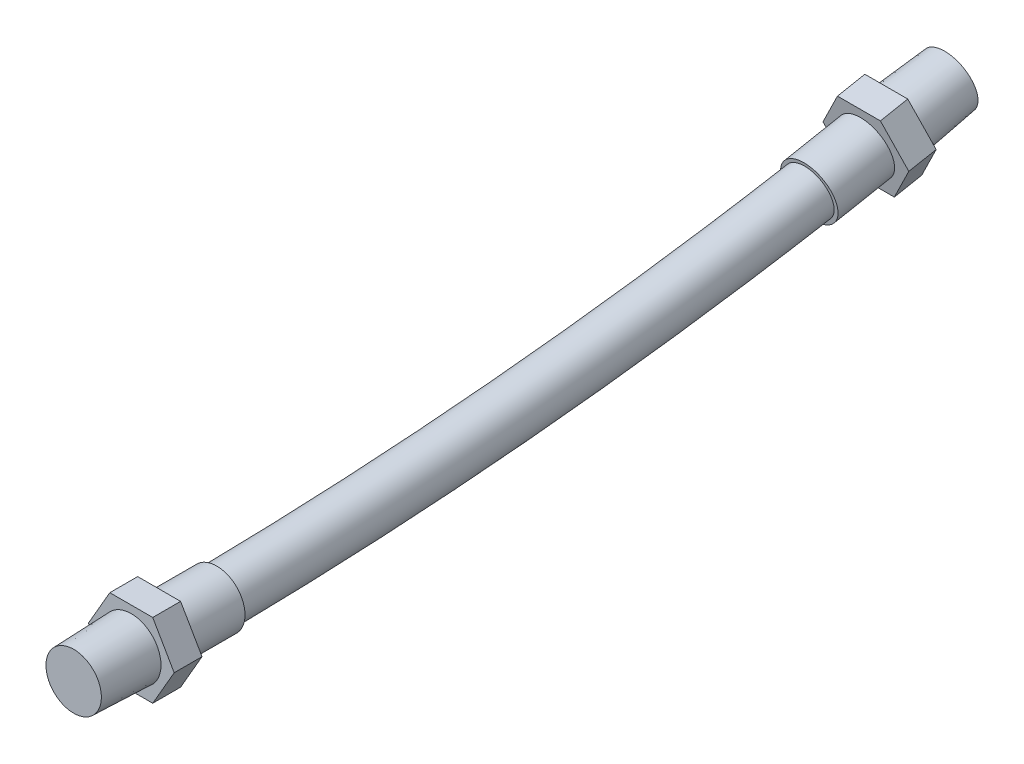
ISO-10303-21;
HEADER;
FILE_DESCRIPTION(('STEP AP214'),'2;1');
FILE_NAME('part.step','',(''),(''),'','','');
FILE_SCHEMA(('AUTOMOTIVE_DESIGN { 1 0 10303 214 1 1 1 1 }'));
ENDSEC;
DATA;
#1=APPLICATION_CONTEXT('core data for automotive mechanical design processes');
#2=APPLICATION_PROTOCOL_DEFINITION('international standard','automotive_design',2000,#1);
#3=PRODUCT_CONTEXT('',#1,'mechanical');
#4=PRODUCT('Part','Part','',(#3));
#5=PRODUCT_RELATED_PRODUCT_CATEGORY('part','',(#4));
#6=PRODUCT_DEFINITION_FORMATION('','',#4);
#7=PRODUCT_DEFINITION_CONTEXT('part definition',#1,'design');
#8=PRODUCT_DEFINITION('design','',#6,#7);
#9=PRODUCT_DEFINITION_SHAPE('','',#8);
#10=(LENGTH_UNIT() NAMED_UNIT(*) SI_UNIT(.MILLI.,.METRE.));
#11=(NAMED_UNIT(*) PLANE_ANGLE_UNIT() SI_UNIT($,.RADIAN.));
#12=(NAMED_UNIT(*) SI_UNIT($,.STERADIAN.) SOLID_ANGLE_UNIT());
#13=UNCERTAINTY_MEASURE_WITH_UNIT(LENGTH_MEASURE(1.E-05),#10,'distance_accuracy_value','');
#14=(GEOMETRIC_REPRESENTATION_CONTEXT(3) GLOBAL_UNCERTAINTY_ASSIGNED_CONTEXT((#13)) GLOBAL_UNIT_ASSIGNED_CONTEXT((#10,
#11,#12)) REPRESENTATION_CONTEXT('',''));
#15=CARTESIAN_POINT('',(0.,0.,0.));
#16=DIRECTION('',(0.,0.,1.));
#17=DIRECTION('',(1.,0.,0.));
#18=AXIS2_PLACEMENT_3D('',#15,#16,#17);
#19=CARTESIAN_POINT('',(3.66617420935412,-6.35,4.7625));
#20=DIRECTION('',(-0.866025403784439,0.499999999999999,0.));
#21=DIRECTION('',(-0.5,-0.866025403784439,0.));
#22=AXIS2_PLACEMENT_3D('',#19,#20,#21);
#23=PLANE('',#22);
#24=DIRECTION('',(0.5,0.866025403784439,0.));
#25=VECTOR('',#24,1.);
#26=CARTESIAN_POINT('',(3.66617420935412,-6.35,0.));
#27=LINE('',#26,#25);
#28=CARTESIAN_POINT('',(3.66617420935412,-6.35,0.));
#29=VERTEX_POINT('',#28);
#30=CARTESIAN_POINT('',(7.33234841870825,0.,0.));
#31=VERTEX_POINT('',#30);
#32=EDGE_CURVE('E129',#29,#31,#27,.T.);
#33=ORIENTED_EDGE('',*,*,#32,.T.);
#34=DIRECTION('',(0.,0.,-1.));
#35=VECTOR('',#34,1.);
#36=CARTESIAN_POINT('',(7.33234841870825,0.,4.7625));
#37=LINE('',#36,#35);
#38=CARTESIAN_POINT('',(7.33234841870825,0.,4.7625));
#39=VERTEX_POINT('',#38);
#40=EDGE_CURVE('E147',#39,#31,#37,.T.);
#41=ORIENTED_EDGE('',*,*,#40,.F.);
#42=DIRECTION('',(0.5,0.866025403784439,0.));
#43=VECTOR('',#42,1.);
#44=CARTESIAN_POINT('',(3.66617420935412,-6.35,4.7625));
#45=LINE('',#44,#43);
#46=CARTESIAN_POINT('',(3.66617420935412,-6.35,4.7625));
#47=VERTEX_POINT('',#46);
#48=EDGE_CURVE('E140',#47,#39,#45,.T.);
#49=ORIENTED_EDGE('',*,*,#48,.F.);
#50=DIRECTION('',(0.,0.,-1.));
#51=VECTOR('',#50,1.);
#52=CARTESIAN_POINT('',(3.66617420935412,-6.35,4.7625));
#53=LINE('',#52,#51);
#54=EDGE_CURVE('E125',#47,#29,#53,.T.);
#55=ORIENTED_EDGE('',*,*,#54,.T.);
#56=EDGE_LOOP('',(#33,#41,#49,#55));
#57=FACE_BOUND('',#56,.T.);
#58=ADVANCED_FACE('F32',(#57),#23,.F.);
#59=CARTESIAN_POINT('',(7.33234841870825,0.,4.7625));
#60=DIRECTION('',(-0.866025403784439,-0.5,0.));
#61=DIRECTION('',(0.5,-0.866025403784439,0.));
#62=AXIS2_PLACEMENT_3D('',#59,#60,#61);
#63=PLANE('',#62);
#64=DIRECTION('',(-0.5,0.866025403784439,0.));
#65=VECTOR('',#64,1.);
#66=CARTESIAN_POINT('',(7.33234841870825,0.,0.));
#67=LINE('',#66,#65);
#68=CARTESIAN_POINT('',(3.66617420935412,6.35000000000001,0.));
#69=VERTEX_POINT('',#68);
#70=EDGE_CURVE('E132',#31,#69,#67,.T.);
#71=ORIENTED_EDGE('',*,*,#70,.T.);
#72=DIRECTION('',(0.,0.,-1.));
#73=VECTOR('',#72,1.);
#74=CARTESIAN_POINT('',(3.66617420935412,6.35000000000001,4.7625));
#75=LINE('',#74,#73);
#76=CARTESIAN_POINT('',(3.66617420935412,6.35000000000001,4.7625));
#77=VERTEX_POINT('',#76);
#78=EDGE_CURVE('E144',#77,#69,#75,.T.);
#79=ORIENTED_EDGE('',*,*,#78,.F.);
#80=DIRECTION('',(-0.5,0.866025403784439,0.));
#81=VECTOR('',#80,1.);
#82=CARTESIAN_POINT('',(7.33234841870825,0.,4.7625));
#83=LINE('',#82,#81);
#84=EDGE_CURVE('E95',#39,#77,#83,.T.);
#85=ORIENTED_EDGE('',*,*,#84,.F.);
#86=ORIENTED_EDGE('',*,*,#40,.T.);
#87=EDGE_LOOP('',(#71,#79,#85,#86));
#88=FACE_BOUND('',#87,.T.);
#89=ADVANCED_FACE('F192',(#88),#63,.F.);
#90=CARTESIAN_POINT('',(3.66617420935412,6.35000000000001,4.7625));
#91=DIRECTION('',(0.,-1.,0.));
#92=DIRECTION('',(0.,0.,-1.));
#93=AXIS2_PLACEMENT_3D('',#90,#91,#92);
#94=PLANE('',#93);
#95=DIRECTION('',(-1.,0.,0.));
#96=VECTOR('',#95,1.);
#97=CARTESIAN_POINT('',(3.66617420935412,6.35000000000001,0.));
#98=LINE('',#97,#96);
#99=CARTESIAN_POINT('',(-3.66617420935413,6.35000000000001,0.));
#100=VERTEX_POINT('',#99);
#101=EDGE_CURVE('E135',#69,#100,#98,.T.);
#102=ORIENTED_EDGE('',*,*,#101,.T.);
#103=DIRECTION('',(0.,0.,-1.));
#104=VECTOR('',#103,1.);
#105=CARTESIAN_POINT('',(-3.66617420935413,6.35000000000001,4.7625));
#106=LINE('',#105,#104);
#107=CARTESIAN_POINT('',(-3.66617420935413,6.35000000000001,4.7625));
#108=VERTEX_POINT('',#107);
#109=EDGE_CURVE('E120',#108,#100,#106,.T.);
#110=ORIENTED_EDGE('',*,*,#109,.F.);
#111=DIRECTION('',(-1.,0.,0.));
#112=VECTOR('',#111,1.);
#113=CARTESIAN_POINT('',(3.66617420935412,6.35000000000001,4.7625));
#114=LINE('',#113,#112);
#115=EDGE_CURVE('E111',#77,#108,#114,.T.);
#116=ORIENTED_EDGE('',*,*,#115,.F.);
#117=ORIENTED_EDGE('',*,*,#78,.T.);
#118=EDGE_LOOP('',(#102,#110,#116,#117));
#119=FACE_BOUND('',#118,.T.);
#120=ADVANCED_FACE('F189',(#119),#94,.F.);
#121=CARTESIAN_POINT('',(-3.66617420935413,6.35000000000001,4.7625));
#122=DIRECTION('',(0.866025403784439,-0.5,0.));
#123=DIRECTION('',(0.5,0.866025403784439,0.));
#124=AXIS2_PLACEMENT_3D('',#121,#122,#123);
#125=PLANE('',#124);
#126=DIRECTION('',(-0.5,-0.866025403784439,0.));
#127=VECTOR('',#126,1.);
#128=CARTESIAN_POINT('',(-3.66617420935413,6.35000000000001,0.));
#129=LINE('',#128,#127);
#130=CARTESIAN_POINT('',(-7.33234841870825,0.,0.));
#131=VERTEX_POINT('',#130);
#132=EDGE_CURVE('E119',#100,#131,#129,.T.);
#133=ORIENTED_EDGE('',*,*,#132,.T.);
#134=DIRECTION('',(0.,0.,-1.));
#135=VECTOR('',#134,1.);
#136=CARTESIAN_POINT('',(-7.33234841870825,0.,4.7625));
#137=LINE('',#136,#135);
#138=CARTESIAN_POINT('',(-7.33234841870825,0.,4.7625));
#139=VERTEX_POINT('',#138);
#140=EDGE_CURVE('E116',#139,#131,#137,.T.);
#141=ORIENTED_EDGE('',*,*,#140,.F.);
#142=DIRECTION('',(-0.5,-0.866025403784439,0.));
#143=VECTOR('',#142,1.);
#144=CARTESIAN_POINT('',(-3.66617420935413,6.35000000000001,4.7625));
#145=LINE('',#144,#143);
#146=EDGE_CURVE('E105',#108,#139,#145,.T.);
#147=ORIENTED_EDGE('',*,*,#146,.F.);
#148=ORIENTED_EDGE('',*,*,#109,.T.);
#149=EDGE_LOOP('',(#133,#141,#147,#148));
#150=FACE_BOUND('',#149,.T.);
#151=ADVANCED_FACE('F117',(#150),#125,.F.);
#152=CARTESIAN_POINT('',(-7.33234841870825,0.,4.7625));
#153=DIRECTION('',(0.866025403784439,0.5,0.));
#154=DIRECTION('',(-0.5,0.866025403784439,0.));
#155=AXIS2_PLACEMENT_3D('',#152,#153,#154);
#156=PLANE('',#155);
#157=DIRECTION('',(0.5,-0.866025403784439,0.));
#158=VECTOR('',#157,1.);
#159=CARTESIAN_POINT('',(-7.33234841870825,0.,0.));
#160=LINE('',#159,#158);
#161=CARTESIAN_POINT('',(-3.66617420935413,-6.35,0.));
#162=VERTEX_POINT('',#161);
#163=EDGE_CURVE('E80',#131,#162,#160,.T.);
#164=ORIENTED_EDGE('',*,*,#163,.T.);
#165=DIRECTION('',(0.,0.,-1.));
#166=VECTOR('',#165,1.);
#167=CARTESIAN_POINT('',(-3.66617420935413,-6.35,4.7625));
#168=LINE('',#167,#166);
#169=CARTESIAN_POINT('',(-3.66617420935413,-6.35,4.7625));
#170=VERTEX_POINT('',#169);
#171=EDGE_CURVE('E121',#170,#162,#168,.T.);
#172=ORIENTED_EDGE('',*,*,#171,.F.);
#173=DIRECTION('',(0.5,-0.866025403784439,0.));
#174=VECTOR('',#173,1.);
#175=CARTESIAN_POINT('',(-7.33234841870825,0.,4.7625));
#176=LINE('',#175,#174);
#177=EDGE_CURVE('E109',#139,#170,#176,.T.);
#178=ORIENTED_EDGE('',*,*,#177,.F.);
#179=ORIENTED_EDGE('',*,*,#140,.T.);
#180=EDGE_LOOP('',(#164,#172,#178,#179));
#181=FACE_BOUND('',#180,.T.);
#182=ADVANCED_FACE('F123',(#181),#156,.F.);
#183=CARTESIAN_POINT('',(-3.66617420935413,-6.35,4.7625));
#184=DIRECTION('',(0.,1.,0.));
#185=DIRECTION('',(-1.,0.,0.));
#186=AXIS2_PLACEMENT_3D('',#183,#184,#185);
#187=PLANE('',#186);
#188=DIRECTION('',(1.,0.,0.));
#189=VECTOR('',#188,1.);
#190=CARTESIAN_POINT('',(-3.66617420935413,-6.35,0.));
#191=LINE('',#190,#189);
#192=EDGE_CURVE('E86',#162,#29,#191,.T.);
#193=ORIENTED_EDGE('',*,*,#192,.T.);
#194=ORIENTED_EDGE('',*,*,#54,.F.);
#195=DIRECTION('',(1.,0.,0.));
#196=VECTOR('',#195,1.);
#197=CARTESIAN_POINT('',(-3.66617420935413,-6.35,4.7625));
#198=LINE('',#197,#196);
#199=EDGE_CURVE('E56',#170,#47,#198,.T.);
#200=ORIENTED_EDGE('',*,*,#199,.F.);
#201=ORIENTED_EDGE('',*,*,#171,.T.);
#202=EDGE_LOOP('',(#193,#194,#200,#201));
#203=FACE_BOUND('',#202,.T.);
#204=ADVANCED_FACE('F178',(#203),#187,.F.);
#205=CARTESIAN_POINT('',(0.,0.,4.7625));
#206=DIRECTION('',(0.,0.,1.));
#207=DIRECTION('',(1.,0.,0.));
#208=AXIS2_PLACEMENT_3D('',#205,#206,#207);
#209=PLANE('',#208);
#210=CARTESIAN_POINT('',(0.,0.,4.7625));
#211=DIRECTION('',(0.,0.,1.));
#212=DIRECTION('',(1.,0.,0.));
#213=AXIS2_PLACEMENT_3D('',#210,#211,#212);
#214=CIRCLE('',#213,5.08);
#215=CARTESIAN_POINT('',(5.08,0.,4.7625));
#216=VERTEX_POINT('',#215);
#217=EDGE_CURVE('E47',#216,#216,#214,.T.);
#218=ORIENTED_EDGE('',*,*,#217,.F.);
#219=EDGE_LOOP('',(#218));
#220=FACE_BOUND('',#219,.T.);
#221=ORIENTED_EDGE('',*,*,#48,.T.);
#222=ORIENTED_EDGE('',*,*,#84,.T.);
#223=ORIENTED_EDGE('',*,*,#115,.T.);
#224=ORIENTED_EDGE('',*,*,#146,.T.);
#225=ORIENTED_EDGE('',*,*,#177,.T.);
#226=ORIENTED_EDGE('',*,*,#199,.T.);
#227=EDGE_LOOP('',(#221,#222,#223,#224,#225,#226));
#228=FACE_BOUND('',#227,.T.);
#229=ADVANCED_FACE('F107',(#220,#228),#209,.T.);
#230=CARTESIAN_POINT('',(0.,0.,0.));
#231=DIRECTION('',(0.,0.,1.));
#232=DIRECTION('',(1.,0.,0.));
#233=AXIS2_PLACEMENT_3D('',#230,#231,#232);
#234=PLANE('',#233);
#235=CARTESIAN_POINT('',(0.,0.,0.));
#236=DIRECTION('',(0.,0.,1.));
#237=DIRECTION('',(1.,0.,0.));
#238=AXIS2_PLACEMENT_3D('',#235,#236,#237);
#239=CIRCLE('',#238,4.826);
#240=CARTESIAN_POINT('',(4.826,0.,0.));
#241=VERTEX_POINT('',#240);
#242=EDGE_CURVE('E11',#241,#241,#239,.F.);
#243=ORIENTED_EDGE('',*,*,#242,.F.);
#244=EDGE_LOOP('',(#243));
#245=FACE_BOUND('',#244,.T.);
#246=ORIENTED_EDGE('',*,*,#32,.F.);
#247=ORIENTED_EDGE('',*,*,#192,.F.);
#248=ORIENTED_EDGE('',*,*,#163,.F.);
#249=ORIENTED_EDGE('',*,*,#132,.F.);
#250=ORIENTED_EDGE('',*,*,#101,.F.);
#251=ORIENTED_EDGE('',*,*,#70,.F.);
#252=EDGE_LOOP('',(#246,#247,#248,#249,#250,#251));
#253=FACE_BOUND('',#252,.T.);
#254=ADVANCED_FACE('F174',(#245,#253),#234,.F.);
#255=CARTESIAN_POINT('',(0.,0.,4.7625));
#256=DIRECTION('',(0.,0.,-1.));
#257=DIRECTION('',(1.,0.,0.));
#258=AXIS2_PLACEMENT_3D('',#255,#256,#257);
#259=CONICAL_SURFACE('',#258,5.08,0.0349065850398866);
#260=CARTESIAN_POINT('',(0.,0.,14.605));
#261=DIRECTION('',(0.,0.,1.));
#262=DIRECTION('',(1.,0.,0.));
#263=AXIS2_PLACEMENT_3D('',#260,#261,#262);
#264=CIRCLE('',#263,4.73629232627747);
#265=CARTESIAN_POINT('',(4.73629232627747,0.,14.605));
#266=VERTEX_POINT('',#265);
#267=EDGE_CURVE('E133',#266,#266,#264,.T.);
#268=ORIENTED_EDGE('',*,*,#267,.F.);
#269=EDGE_LOOP('',(#268));
#270=FACE_BOUND('',#269,.T.);
#271=ORIENTED_EDGE('',*,*,#217,.T.);
#272=EDGE_LOOP('',(#271));
#273=FACE_BOUND('',#272,.T.);
#274=ADVANCED_FACE('F170',(#270,#273),#259,.T.);
#275=CARTESIAN_POINT('',(0.,0.,14.605));
#276=DIRECTION('',(0.,0.,1.));
#277=DIRECTION('',(1.,0.,0.));
#278=AXIS2_PLACEMENT_3D('',#275,#276,#277);
#279=PLANE('',#278);
#280=ORIENTED_EDGE('',*,*,#267,.T.);
#281=EDGE_LOOP('',(#280));
#282=FACE_BOUND('',#281,.T.);
#283=ADVANCED_FACE('F161',(#282),#279,.T.);
#284=CARTESIAN_POINT('',(0.,0.,-9.8425));
#285=DIRECTION('',(0.,0.,-1.));
#286=DIRECTION('',(-1.,0.,0.));
#287=AXIS2_PLACEMENT_3D('',#284,#285,#286);
#288=PLANE('',#287);
#289=CARTESIAN_POINT('',(0.,0.,-9.8425));
#290=DIRECTION('',(0.,0.,-1.));
#291=DIRECTION('',(-1.,0.,0.));
#292=AXIS2_PLACEMENT_3D('',#289,#290,#291);
#293=CIRCLE('',#292,4.826);
#294=CARTESIAN_POINT('',(-4.826,0.,-9.8425));
#295=VERTEX_POINT('',#294);
#296=EDGE_CURVE('E154',#295,#295,#293,.T.);
#297=ORIENTED_EDGE('',*,*,#296,.T.);
#298=EDGE_LOOP('',(#297));
#299=FACE_BOUND('',#298,.T.);
#300=CARTESIAN_POINT('',(-2.96557878047052,-2.8864777574931,-9.8425));
#301=CARTESIAN_POINT('',(-3.1319274965473,-2.71985959375388,-9.8425));
#302=CARTESIAN_POINT('',(-3.28432553139563,-2.53907065060835,-9.8425));
#303=CARTESIAN_POINT('',(-3.55672795271336,-2.15431894818747,-9.8425));
#304=CARTESIAN_POINT('',(-3.67669305796996,-1.95032850921932,-9.8425));
#305=CARTESIAN_POINT('',(-3.88061945775281,-1.52517954267242,-9.8425));
#306=CARTESIAN_POINT('',(-3.96459806072511,-1.30402932902719,-9.8425));
#307=CARTESIAN_POINT('',(-4.09421268723008,-0.850829894358464,-9.8425));
#308=CARTESIAN_POINT('',(-4.13985823553484,-0.618783395919967,-9.8425));
#309=CARTESIAN_POINT('',(-4.19155845363318,-0.150279834976739,-9.8425));
#310=CARTESIAN_POINT('',(-4.19760641415862,0.0861779681568454,-9.8425));
#311=CARTESIAN_POINT('',(-4.16991979168381,0.556762035416266,-9.8425));
#312=CARTESIAN_POINT('',(-4.13618363437283,0.790888206906599,-9.8425));
#313=CARTESIAN_POINT('',(-4.02988311628325,1.25015613494171,-9.8425));
#314=CARTESIAN_POINT('',(-3.95731835576464,1.47529779896545,-9.8425));
#315=CARTESIAN_POINT('',(-3.77541914290732,1.91020169681065,-9.8425));
#316=CARTESIAN_POINT('',(-3.6660847697806,2.11996396376244,-9.8425));
#317=CARTESIAN_POINT('',(-3.4137543615793,2.51814448032545,-9.8425));
#318=CARTESIAN_POINT('',(-3.27075982527992,2.70656367971941,-9.8425));
#319=CARTESIAN_POINT('',(-2.95516475902218,3.05671758037109,-9.8425));
#320=CARTESIAN_POINT('',(-2.78256429733572,3.21845234316201,-9.8425));
#321=CARTESIAN_POINT('',(-2.41267538154885,3.51062880417156,-9.8425));
#322=CARTESIAN_POINT('',(-2.21538943885816,3.64107368177519,-9.8425));
#323=CARTESIAN_POINT('',(-1.80171574723512,3.86698624188334,-9.8425));
#324=CARTESIAN_POINT('',(-1.58532799032638,3.96245390978225,-9.8425));
#325=CARTESIAN_POINT('',(-1.1396197884299,4.11569078915616,-9.8425));
#326=CARTESIAN_POINT('',(-0.910300809927761,4.17346426609658,-9.8425));
#327=CARTESIAN_POINT('',(-0.445218229528382,4.24968864447811,-9.8425));
#328=CARTESIAN_POINT('',(-0.20945463342387,4.26813958126302,-9.8425));
#329=CARTESIAN_POINT('',(0.261806188605222,4.26519485343562,-9.8425));
#330=CARTESIAN_POINT('',(0.497303432818373,4.24380211470062,-9.8425));
#331=CARTESIAN_POINT('',(0.961363787960404,4.16178353207849,-9.8425));
#332=CARTESIAN_POINT('',(1.18992689886454,4.10115768805133,-9.8425));
#333=CARTESIAN_POINT('',(1.63363082238556,3.94239512592053,-9.8425));
#334=CARTESIAN_POINT('',(1.84877165460479,3.84425846260042,-9.8425));
#335=CARTESIAN_POINT('',(2.259525565169,3.61326145810458,-9.8425));
#336=CARTESIAN_POINT('',(2.45513863862877,3.48040110824215,-9.8425));
#337=CARTESIAN_POINT('',(2.82129958666566,3.18371870096074,-9.8425));
#338=CARTESIAN_POINT('',(2.99184567162357,3.01989443482723,-9.8425));
#339=CARTESIAN_POINT('',(3.30301722447802,2.66594173974506,-9.8425));
#340=CARTESIAN_POINT('',(3.44364267352769,2.47581329422763,-9.8425));
#341=CARTESIAN_POINT('',(3.69099784803888,2.07462661130136,-9.8425));
#342=CARTESIAN_POINT('',(3.7977237654693,1.86356602601756,-9.8425));
#343=CARTESIAN_POINT('',(3.97423092548041,1.42652412690544,-9.8425));
#344=CARTESIAN_POINT('',(4.04401215020763,1.20054280586675,-9.8425));
#345=CARTESIAN_POINT('',(4.14465595914912,0.740049301359361,-9.8425));
#346=CARTESIAN_POINT('',(4.17551452751146,0.505536240194601,-9.8425));
#347=CARTESIAN_POINT('',(4.19742444282078,0.0346577589704663,-9.8425));
#348=CARTESIAN_POINT('',(4.18847575880019,-0.201707662529786,-9.8425));
#349=CARTESIAN_POINT('',(4.13102346780934,-0.669593308425957,-9.8425));
#350=CARTESIAN_POINT('',(4.08251790932897,-0.901113293197725,-9.8425));
#351=CARTESIAN_POINT('',(3.94732543788786,-1.35272322185132,-9.8425));
#352=CARTESIAN_POINT('',(3.86063856633192,-1.57281317812788,-9.8425));
#353=CARTESIAN_POINT('',(3.65154575580313,-1.99530884893692,-9.8425));
#354=CARTESIAN_POINT('',(3.52914076607921,-2.19771503324968,-9.8425));
#355=CARTESIAN_POINT('',(3.25208396066203,-2.5791024743199,-9.8425));
#356=CARTESIAN_POINT('',(3.09743210016555,-2.7580836985306,-9.8425));
#357=CARTESIAN_POINT('',(2.76028654850061,-3.08752227999339,-9.8425));
#358=CARTESIAN_POINT('',(2.5777953969934,-3.23798223631564,-9.8425));
#359=CARTESIAN_POINT('',(2.19014041596236,-3.50612508854186,-9.8425));
#360=CARTESIAN_POINT('',(1.98497655479314,-3.62380793869646,-9.8425));
#361=CARTESIAN_POINT('',(1.55782148711543,-3.82304352989664,-9.8425));
#362=CARTESIAN_POINT('',(1.33583187135689,-3.90459968147552,-9.8425));
#363=CARTESIAN_POINT('',(0.881319105730015,-4.0292782974918,-9.8425));
#364=CARTESIAN_POINT('',(0.648796375673294,-4.07240229228135,-9.8425));
#365=CARTESIAN_POINT('',(0.179857906333541,-4.11899387369949,-9.8425));
#366=CARTESIAN_POINT('',(-0.0565570752086031,-4.12246908980356,-9.8425));
#367=CARTESIAN_POINT('',(-0.526678936942011,-4.08967493569219,-9.8425));
#368=CARTESIAN_POINT('',(-0.760385130002331,-4.05339569480081,-9.8425));
#369=CARTESIAN_POINT('',(-1.21847356167673,-3.94210174676903,-9.8425));
#370=CARTESIAN_POINT('',(-1.44285153028566,-3.8670695068267,-9.8425));
#371=CARTESIAN_POINT('',(-1.87562326753753,-3.68043328774961,-9.8425));
#372=CARTESIAN_POINT('',(-2.08403593953287,-3.5688734108191,-9.8425));
#373=CARTESIAN_POINT('',(-2.40484037316941,-3.36067912672088,-9.8425));
#374=CARTESIAN_POINT('',(-2.52391687781406,-3.27415294775686,-9.8425));
#375=CARTESIAN_POINT('',(-2.75233597711176,-3.08908651494892,-9.8425));
#376=CARTESIAN_POINT('',(-2.86167857183684,-2.99054626119393,-9.8425));
#377=CARTESIAN_POINT('',(-2.96557878047052,-2.8864777574931,-9.8425));
#378=B_SPLINE_CURVE_WITH_KNOTS('',3,(#300,#301,#302,#303,#304,#305,#306,#307,#308,#309,#310,
#311,#312,#313,#314,#315,#316,#317,#318,#319,#320,#321,#322,#323,#324,#325,#326,#327,#328,#329,
#330,#331,#332,#333,#334,#335,#336,#337,#338,#339,#340,#341,#342,#343,#344,#345,#346,#347,#348,
#349,#350,#351,#352,#353,#354,#355,#356,#357,#358,#359,#360,#361,#362,#363,#364,#365,#366,#367,
#368,#369,#370,#371,#372,#373,#374,#375,#376,#377),.UNSPECIFIED.,.T.,.F.,(4,2,2,2,2,2,2,2,2,2,2,
2,2,2,2,2,2,2,2,2,2,2,2,2,2,2,2,2,2,2,2,2,2,2,2,2,2,2,4),(0.,0.705792820119992,1.41243667169095,
2.11874026589544,2.82486830996592,3.5311159946528,4.23739162744222,4.94367453147072,
5.64995591397862,6.35620585407027,7.06245416555606,7.76863068427689,8.47480749787908,
9.18090438681979,9.88700064110805,10.5930450460244,11.2990894534607,12.005132829742,
12.7111763826518,13.4172703179996,14.1233646981112,14.8295383677906,15.535712378727,
16.2419592433332,16.9482066573558,17.6544889156975,18.3607704081307,19.0670331320527,
19.7732968372497,20.4794961514705,21.1856964513796,21.8918300683836,22.5979355661905,
23.3039051882998,24.0100501360748,24.7165148412626,25.422129711417,25.8629628211331,
26.3037959275862),.UNSPECIFIED.);
#379=CARTESIAN_POINT('',(-2.96557878047052,-2.8864777574931,-9.8425));
#380=VERTEX_POINT('',#379);
#381=EDGE_CURVE('E148',#380,#380,#378,.T.);
#382=ORIENTED_EDGE('',*,*,#381,.F.);
#383=EDGE_LOOP('',(#382));
#384=FACE_BOUND('',#383,.T.);
#385=ADVANCED_FACE('F155',(#299,#384),#288,.T.);
#386=CARTESIAN_POINT('',(0.,0.,-9.8425));
#387=DIRECTION('',(0.,0.,1.));
#388=DIRECTION('',(1.,0.,0.));
#389=AXIS2_PLACEMENT_3D('',#386,#387,#388);
#390=CYLINDRICAL_SURFACE('',#389,4.826);
#391=ORIENTED_EDGE('',*,*,#296,.F.);
#392=EDGE_LOOP('',(#391));
#393=FACE_BOUND('',#392,.T.);
#394=ORIENTED_EDGE('',*,*,#242,.T.);
#395=EDGE_LOOP('',(#394));
#396=FACE_BOUND('',#395,.T.);
#397=ADVANCED_FACE('F160',(#393,#396),#390,.T.);
#398=CARTESIAN_POINT('',(0.,643.6752258296,0.));
#399=DIRECTION('',(1.,0.,0.));
#400=DIRECTION('',(0.,0.,-1.));
#401=AXIS2_PLACEMENT_3D('',#398,#399,#400);
#402=TOROIDAL_SURFACE('',#401,643.6752258296,4.191);
#403=CARTESIAN_POINT('',(-2.77137201166855,6.56890465782001,-111.671350462145));
#404=CARTESIAN_POINT('',(-2.5947882600736,6.4160038000417,-111.700555601159));
#405=CARTESIAN_POINT('',(-2.40493105451219,6.27763807852882,-111.726984426938));
#406=CARTESIAN_POINT('',(-2.00410120945124,6.03406787871835,-111.773508047856));
#407=CARTESIAN_POINT('',(-1.79310344262091,5.92890349400822,-111.793595184838));
#408=CARTESIAN_POINT('',(-1.35620559318564,5.75491130311628,-111.826828916789));
#409=CARTESIAN_POINT('',(-1.13031261347034,5.68606631673359,-111.839978793297));
#410=CARTESIAN_POINT('',(-0.670027106568295,5.5866278990292,-111.858972230317));
#411=CARTESIAN_POINT('',(-0.435636704555516,5.55602497049899,-111.864817604862));
#412=CARTESIAN_POINT('',(0.0350607320588716,5.5339020283488,-111.869043242378));
#413=CARTESIAN_POINT('',(0.271367858116757,5.5423838907369,-111.867423147019));
#414=CARTESIAN_POINT('',(0.739187139049497,5.59819659877095,-111.856762527316));
#415=CARTESIAN_POINT('',(0.970699106417026,5.64552896067676,-111.847721713357));
#416=CARTESIAN_POINT('',(1.42233956653831,5.77769745068546,-111.822476602374));
#417=CARTESIAN_POINT('',(1.64246842382071,5.86253237698788,-111.806272534902));
#418=CARTESIAN_POINT('',(2.0651024076672,6.06729613259933,-111.767161217708));
#419=CARTESIAN_POINT('',(2.26760756575921,6.18722489912557,-111.744253979978));
#420=CARTESIAN_POINT('',(2.64925981767069,6.45877910011975,-111.692385218054));
#421=CARTESIAN_POINT('',(2.82840548828139,6.61040646440442,-111.663423325252));
#422=CARTESIAN_POINT('',(3.15824092622818,6.94104788601202,-111.600268488697));
#423=CARTESIAN_POINT('',(3.3089307295104,7.12006190873897,-111.566075551553));
#424=CARTESIAN_POINT('',(3.57759444923796,7.50041545994716,-111.493425348675));
#425=CARTESIAN_POINT('',(3.69556488095939,7.70175736322915,-111.454967629338));
#426=CARTESIAN_POINT('',(3.89542221361209,8.12103592029206,-111.374882476626));
#427=CARTESIAN_POINT('',(3.97730905407356,8.33897260188222,-111.33325503794));
#428=CARTESIAN_POINT('',(4.10268322974837,8.7852790185323,-111.248007373991));
#429=CARTESIAN_POINT('',(4.14616645309652,9.01364986802333,-111.204386935864));
#430=CARTESIAN_POINT('',(4.19348505864035,9.47432065076557,-111.116395576983));
#431=CARTESIAN_POINT('',(4.19732043956518,9.70662058414272,-111.072024656205));
#432=CARTESIAN_POINT('',(4.16523361076877,10.1685705724762,-110.983788960061));
#433=CARTESIAN_POINT('',(4.12930893742881,10.3982204623392,-110.939924216229));
#434=CARTESIAN_POINT('',(4.01871714865389,10.8483365244955,-110.853948883199));
#435=CARTESIAN_POINT('',(3.94405002593303,11.0688026950618,-110.811838294331));
#436=CARTESIAN_POINT('',(3.75809274989,11.494289734913,-110.73056727775));
#437=CARTESIAN_POINT('',(3.64680301160341,11.6993107792015,-110.691406816609));
#438=CARTESIAN_POINT('',(3.39075810081934,12.0880887575539,-110.617147488908));
#439=CARTESIAN_POINT('',(3.24600294158442,12.2718457000448,-110.582048620737));
#440=CARTESIAN_POINT('',(2.92714828179165,12.612862964509,-110.516911925235));
#441=CARTESIAN_POINT('',(2.75305113485777,12.7701254096775,-110.486873692359));
#442=CARTESIAN_POINT('',(2.38044581069458,13.0537048463036,-110.432708025869));
#443=CARTESIAN_POINT('',(2.18193764722027,13.180021855198,-110.408580588926));
#444=CARTESIAN_POINT('',(1.76616963732665,13.398109366322,-110.366924340738));
#445=CARTESIAN_POINT('',(1.5489119342282,13.4898838108111,-110.349394776494));
#446=CARTESIAN_POINT('',(1.10179307021631,13.6362993266671,-110.321428383391));
#447=CARTESIAN_POINT('',(0.871931918471482,13.6909404250471,-110.310991549371));
#448=CARTESIAN_POINT('',(0.406155358743035,13.7615333453722,-110.297507805189));
#449=CARTESIAN_POINT('',(0.170240545644251,13.7774889542841,-110.294460171689));
#450=CARTESIAN_POINT('',(-0.300967646874084,13.7702686712481,-110.295839296521));
#451=CARTESIAN_POINT('',(-0.53626102624033,13.7470927759439,-110.300266055494));
#452=CARTESIAN_POINT('',(-0.999537830710151,13.6622694856673,-110.316467900403));
#453=CARTESIAN_POINT('',(-1.22752152897232,13.6006235300648,-110.328242711409));
#454=CARTESIAN_POINT('',(-1.66971682205164,13.4406125574878,-110.358805932348));
#455=CARTESIAN_POINT('',(-1.88392843000919,13.3422475755488,-110.377594335588));
#456=CARTESIAN_POINT('',(-2.29250841933113,13.1115876427887,-110.421652004716));
#457=CARTESIAN_POINT('',(-2.48687603069457,12.9792913760406,-110.446921521955));
#458=CARTESIAN_POINT('',(-2.85024350328365,12.6845271950077,-110.503223553276));
#459=CARTESIAN_POINT('',(-3.0192433067566,12.5220592120354,-110.534256080478));
#460=CARTESIAN_POINT('',(-3.32709512242416,12.171547224283,-110.601206334893));
#461=CARTESIAN_POINT('',(-3.46594421998817,11.9835007497177,-110.637124533854));
#462=CARTESIAN_POINT('',(-3.70953518212215,11.5871817278302,-110.712824253898));
#463=CARTESIAN_POINT('',(-3.81427695643924,11.3789091269886,-110.752605785205));
#464=CARTESIAN_POINT('',(-3.98669360582232,10.948020990965,-110.834908449135));
#465=CARTESIAN_POINT('',(-4.05436356308349,10.7254035572283,-110.877429944396));
#466=CARTESIAN_POINT('',(-4.15069342981779,10.2721782064165,-110.963999173423));
#467=CARTESIAN_POINT('',(-4.17935485023165,10.0415705991845,-111.008046848007));
#468=CARTESIAN_POINT('',(-4.19686097269517,9.57890907070013,-111.096418453323));
#469=CARTESIAN_POINT('',(-4.18570669028725,9.34685518648729,-111.140742376981));
#470=CARTESIAN_POINT('',(-4.12388665444771,8.88781754980385,-111.228421793481));
#471=CARTESIAN_POINT('',(-4.073211076024,8.66083507252019,-111.271777042753));
#472=CARTESIAN_POINT('',(-3.93376094269357,8.21835924270906,-111.35629303768));
#473=CARTESIAN_POINT('',(-3.84496783293186,8.00287154311856,-111.397452703583));
#474=CARTESIAN_POINT('',(-3.63185221247446,7.58979601428986,-111.476353034283));
#475=CARTESIAN_POINT('',(-3.50757257430659,7.39218696231478,-111.514097752772));
#476=CARTESIAN_POINT('',(-3.27981112879511,7.09018024121273,-111.571783160174));
#477=CARTESIAN_POINT('',(-3.18600435952271,6.97861510232568,-111.593092886213));
#478=CARTESIAN_POINT('',(-2.98698516934419,6.7657743678564,-111.633746963165));
#479=CARTESIAN_POINT('',(-2.88177274846784,6.6644987722473,-111.653091314084));
#480=CARTESIAN_POINT('',(-2.77137201166855,6.56890465782001,-111.671350462145));
#481=B_SPLINE_CURVE_WITH_KNOTS('',3,(#403,#404,#405,#406,#407,#408,#409,#410,#411,#412,#413,
#414,#415,#416,#417,#418,#419,#420,#421,#422,#423,#424,#425,#426,#427,#428,#429,#430,#431,#432,
#433,#434,#435,#436,#437,#438,#439,#440,#441,#442,#443,#444,#445,#446,#447,#448,#449,#450,#451,
#452,#453,#454,#455,#456,#457,#458,#459,#460,#461,#462,#463,#464,#465,#466,#467,#468,#469,#470,
#471,#472,#473,#474,#475,#476,#477,#478,#479,#480),.UNSPECIFIED.,.T.,.F.,(4,2,2,2,2,2,2,2,2,2,2,
2,2,2,2,2,2,2,2,2,2,2,2,2,2,2,2,2,2,2,2,2,2,2,2,2,2,2,4),(0.,0.705664628590087,1.41217817947655,
2.11835722721548,2.82436086432626,3.53039838884697,4.23646346995715,4.94250592627207,
5.64854711948648,6.35463130914855,7.06071460686261,7.76687307598819,8.4730327285075,
9.17926798019191,9.88550325451321,10.5917822911454,11.2980614606006,12.0043326262339,
12.7106035119677,13.4168177721706,14.1230316344416,14.8291648737729,15.5352975994213,
16.2413611981411,16.9474248574215,17.653462100682,18.3594986702792,19.065562625608,
19.7716281883471,20.4777619751955,21.1838976305602,21.8901269364993,22.5963288868626,
23.3025128249125,24.008872376235,24.7155761599067,25.4214297362927,25.8626135622632,
26.3037973870822),.UNSPECIFIED.);
#482=CARTESIAN_POINT('',(-2.77137201166855,6.56890465782001,-111.671350462145));
#483=VERTEX_POINT('',#482);
#484=EDGE_CURVE('E37',#483,#483,#481,.T.);
#485=ORIENTED_EDGE('',*,*,#484,.T.);
#486=EDGE_LOOP('',(#485));
#487=FACE_BOUND('',#486,.T.);
#488=ORIENTED_EDGE('',*,*,#381,.T.);
#489=EDGE_LOOP('',(#488));
#490=FACE_BOUND('',#489,.T.);
#491=ADVANCED_FACE('F34',(#487,#490),#402,.T.);
#492=CARTESIAN_POINT('',(0.,9.58339696935196,-111.095561233123));
#493=DIRECTION('',(0.,-0.187615243144327,0.982242597599949));
#494=DIRECTION('',(-1.,0.,0.));
#495=AXIS2_PLACEMENT_3D('',#492,#493,#494);
#496=PLANE('',#495);
#497=CARTESIAN_POINT('',(0.,9.58339696935196,-111.095561233123));
#498=DIRECTION('',(0.,0.187615243144327,-0.982242597599949));
#499=DIRECTION('',(-1.,0.,0.));
#500=AXIS2_PLACEMENT_3D('',#497,#498,#499);
#501=CIRCLE('',#500,4.826);
#502=CARTESIAN_POINT('',(-4.826,9.58339696935196,-111.095561233123));
#503=VERTEX_POINT('',#502);
#504=EDGE_CURVE('E276',#503,#503,#501,.T.);
#505=ORIENTED_EDGE('',*,*,#504,.F.);
#506=EDGE_LOOP('',(#505));
#507=FACE_BOUND('',#506,.T.);
#508=ORIENTED_EDGE('',*,*,#484,.F.);
#509=EDGE_LOOP('',(#508));
#510=FACE_BOUND('',#509,.T.);
#511=ADVANCED_FACE('F285',(#507,#510),#496,.T.);
#512=CARTESIAN_POINT('',(0.,9.58339696935196,-111.095561233123));
#513=DIRECTION('',(0.,0.187615243144327,-0.982242597599949));
#514=DIRECTION('',(0.,0.982242597599949,0.187615243144327));
#515=AXIS2_PLACEMENT_3D('',#512,#513,#514);
#516=CYLINDRICAL_SURFACE('',#515,4.826);
#517=ORIENTED_EDGE('',*,*,#504,.T.);
#518=EDGE_LOOP('',(#517));
#519=FACE_BOUND('',#518,.T.);
#520=CARTESIAN_POINT('',(0.,11.43,-120.763284));
#521=DIRECTION('',(0.,0.187615243144327,-0.982242597599949));
#522=DIRECTION('',(-1.,0.,0.));
#523=AXIS2_PLACEMENT_3D('',#520,#521,#522);
#524=CIRCLE('',#523,4.826);
#525=CARTESIAN_POINT('',(-4.826,11.43,-120.763284));
#526=VERTEX_POINT('',#525);
#527=EDGE_CURVE('E273',#526,#526,#524,.T.);
#528=ORIENTED_EDGE('',*,*,#527,.F.);
#529=EDGE_LOOP('',(#528));
#530=FACE_BOUND('',#529,.T.);
#531=ADVANCED_FACE('F287',(#519,#530),#516,.T.);
#532=CARTESIAN_POINT('',(0.,14.1701206261229,-135.108937137947));
#533=DIRECTION('',(0.,0.187615243144327,-0.982242597599949));
#534=DIRECTION('',(1.,0.,0.));
#535=AXIS2_PLACEMENT_3D('',#532,#533,#534);
#536=PLANE('',#535);
#537=CARTESIAN_POINT('',(0.,14.1701206261229,-135.108937137947));
#538=DIRECTION('',(0.,0.187615243144327,-0.982242597599949));
#539=DIRECTION('',(0.,0.982242597599949,0.187615243144327));
#540=AXIS2_PLACEMENT_3D('',#537,#538,#539);
#541=CIRCLE('',#540,4.73629232627747);
#542=CARTESIAN_POINT('',(0.,18.8223087036784,-134.22033650155));
#543=VERTEX_POINT('',#542);
#544=EDGE_CURVE('E251',#543,#543,#541,.F.);
#545=ORIENTED_EDGE('',*,*,#544,.F.);
#546=EDGE_LOOP('',(#545));
#547=FACE_BOUND('',#546,.T.);
#548=ADVANCED_FACE('F293',(#547),#536,.T.);
#549=CARTESIAN_POINT('',(0.,12.3235175954748,-125.44121437107));
#550=DIRECTION('',(0.,-0.187615243144327,0.982242597599949));
#551=DIRECTION('',(1.,0.,0.));
#552=AXIS2_PLACEMENT_3D('',#549,#550,#551);
#553=CONICAL_SURFACE('',#552,5.08,0.0349065850398866);
#554=ORIENTED_EDGE('',*,*,#544,.T.);
#555=EDGE_LOOP('',(#554));
#556=FACE_BOUND('',#555,.T.);
#557=CARTESIAN_POINT('',(0.,12.3235175954748,-125.44121437107));
#558=DIRECTION('',(0.,-0.187615243144327,0.982242597599949));
#559=DIRECTION('',(1.,0.,0.));
#560=AXIS2_PLACEMENT_3D('',#557,#558,#559);
#561=CIRCLE('',#560,5.08);
#562=CARTESIAN_POINT('',(5.08,12.3235175954748,-125.44121437107));
#563=VERTEX_POINT('',#562);
#564=EDGE_CURVE('E270',#563,#563,#561,.T.);
#565=ORIENTED_EDGE('',*,*,#564,.F.);
#566=EDGE_LOOP('',(#565));
#567=FACE_BOUND('',#566,.T.);
#568=ADVANCED_FACE('F299',(#556,#567),#553,.T.);
#569=CARTESIAN_POINT('',(0.,12.3235175954748,-125.44121437107));
#570=DIRECTION('',(0.,0.187615243144327,-0.982242597599949));
#571=DIRECTION('',(1.,0.,0.));
#572=AXIS2_PLACEMENT_3D('',#569,#570,#571);
#573=PLANE('',#572);
#574=ORIENTED_EDGE('',*,*,#564,.T.);
#575=EDGE_LOOP('',(#574));
#576=FACE_BOUND('',#575,.T.);
#577=DIRECTION('',(0.5,0.850647042200772,0.162479566700181));
#578=VECTOR('',#577,1.);
#579=CARTESIAN_POINT('',(3.66617420935412,6.08627710071517,-126.632571165036));
#580=LINE('',#579,#578);
#581=CARTESIAN_POINT('',(3.66617420935412,6.08627710071517,-126.632571165036));
#582=VERTEX_POINT('',#581);
#583=CARTESIAN_POINT('',(7.33234841870825,12.3235175954749,-125.44121437107));
#584=VERTEX_POINT('',#583);
#585=EDGE_CURVE('E235',#582,#584,#580,.T.);
#586=ORIENTED_EDGE('',*,*,#585,.F.);
#587=DIRECTION('',(1.,0.,0.));
#588=VECTOR('',#587,1.);
#589=CARTESIAN_POINT('',(-3.66617420935413,6.08627710071517,-126.632571165036));
#590=LINE('',#589,#588);
#591=CARTESIAN_POINT('',(-3.66617420935413,6.08627710071517,-126.632571165036));
#592=VERTEX_POINT('',#591);
#593=EDGE_CURVE('E263',#592,#582,#590,.T.);
#594=ORIENTED_EDGE('',*,*,#593,.F.);
#595=DIRECTION('',(0.5,-0.850647042200772,-0.162479566700181));
#596=VECTOR('',#595,1.);
#597=CARTESIAN_POINT('',(-7.33234841870825,12.3235175954748,-125.44121437107));
#598=LINE('',#597,#596);
#599=CARTESIAN_POINT('',(-7.33234841870825,12.3235175954748,-125.44121437107));
#600=VERTEX_POINT('',#599);
#601=EDGE_CURVE('E260',#600,#592,#598,.T.);
#602=ORIENTED_EDGE('',*,*,#601,.F.);
#603=DIRECTION('',(-0.5,-0.850647042200772,-0.162479566700181));
#604=VECTOR('',#603,1.);
#605=CARTESIAN_POINT('',(-3.66617420935413,18.5607580902345,-124.249857577103));
#606=LINE('',#605,#604);
#607=CARTESIAN_POINT('',(-3.66617420935413,18.5607580902345,-124.249857577103));
#608=VERTEX_POINT('',#607);
#609=EDGE_CURVE('E257',#608,#600,#606,.T.);
#610=ORIENTED_EDGE('',*,*,#609,.F.);
#611=DIRECTION('',(-1.,0.,0.));
#612=VECTOR('',#611,1.);
#613=CARTESIAN_POINT('',(3.66617420935412,18.5607580902345,-124.249857577103));
#614=LINE('',#613,#612);
#615=CARTESIAN_POINT('',(3.66617420935412,18.5607580902345,-124.249857577103));
#616=VERTEX_POINT('',#615);
#617=EDGE_CURVE('E254',#616,#608,#614,.T.);
#618=ORIENTED_EDGE('',*,*,#617,.F.);
#619=DIRECTION('',(-0.5,0.850647042200772,0.162479566700181));
#620=VECTOR('',#619,1.);
#621=CARTESIAN_POINT('',(7.33234841870825,12.3235175954749,-125.44121437107));
#622=LINE('',#621,#620);
#623=EDGE_CURVE('E231',#584,#616,#622,.T.);
#624=ORIENTED_EDGE('',*,*,#623,.F.);
#625=EDGE_LOOP('',(#586,#594,#602,#610,#618,#624));
#626=FACE_BOUND('',#625,.T.);
#627=ADVANCED_FACE('F303',(#576,#626),#573,.T.);
#628=CARTESIAN_POINT('',(-3.66617420935413,6.08627710071517,-126.632571165036));
#629=DIRECTION('',(0.,-0.982242597599949,-0.187615243144327));
#630=DIRECTION('',(0.,0.187615243144327,-0.982242597599949));
#631=AXIS2_PLACEMENT_3D('',#628,#629,#630);
#632=PLANE('',#631);
#633=DIRECTION('',(1.,0.,0.));
#634=VECTOR('',#633,1.);
#635=CARTESIAN_POINT('',(-3.66617420935413,5.19275950524031,-121.954640793966));
#636=LINE('',#635,#634);
#637=CARTESIAN_POINT('',(-3.66617420935413,5.19275950524031,-121.954640793966));
#638=VERTEX_POINT('',#637);
#639=CARTESIAN_POINT('',(3.66617420935412,5.19275950524031,-121.954640793966));
#640=VERTEX_POINT('',#639);
#641=EDGE_CURVE('E245',#638,#640,#636,.T.);
#642=ORIENTED_EDGE('',*,*,#641,.F.);
#643=DIRECTION('',(0.,-0.187615243144327,0.982242597599949));
#644=VECTOR('',#643,1.);
#645=CARTESIAN_POINT('',(-3.66617420935413,6.08627710071517,-126.632571165036));
#646=LINE('',#645,#644);
#647=EDGE_CURVE('E216',#592,#638,#646,.T.);
#648=ORIENTED_EDGE('',*,*,#647,.F.);
#649=ORIENTED_EDGE('',*,*,#593,.T.);
#650=DIRECTION('',(0.,-0.187615243144327,0.982242597599949));
#651=VECTOR('',#650,1.);
#652=CARTESIAN_POINT('',(3.66617420935412,6.08627710071517,-126.632571165036));
#653=LINE('',#652,#651);
#654=EDGE_CURVE('E213',#582,#640,#653,.T.);
#655=ORIENTED_EDGE('',*,*,#654,.T.);
#656=EDGE_LOOP('',(#642,#648,#649,#655));
#657=FACE_BOUND('',#656,.T.);
#658=ADVANCED_FACE('F307',(#657),#632,.T.);
#659=CARTESIAN_POINT('',(-7.33234841870825,12.3235175954748,-125.44121437107));
#660=DIRECTION('',(-0.866025403784439,-0.491121298799974,-0.0938076215721634));
#661=DIRECTION('',(0.493296567695637,-0.869861193696847,0.));
#662=AXIS2_PLACEMENT_3D('',#659,#660,#661);
#663=PLANE('',#662);
#664=DIRECTION('',(0.5,-0.850647042200772,-0.162479566700181));
#665=VECTOR('',#664,1.);
#666=CARTESIAN_POINT('',(-7.33234841870825,11.43,-120.763284));
#667=LINE('',#666,#665);
#668=CARTESIAN_POINT('',(-7.33234841870825,11.43,-120.763284));
#669=VERTEX_POINT('',#668);
#670=EDGE_CURVE('E242',#669,#638,#667,.T.);
#671=ORIENTED_EDGE('',*,*,#670,.F.);
#672=DIRECTION('',(0.,-0.187615243144327,0.982242597599949));
#673=VECTOR('',#672,1.);
#674=CARTESIAN_POINT('',(-7.33234841870825,12.3235175954748,-125.44121437107));
#675=LINE('',#674,#673);
#676=EDGE_CURVE('E219',#600,#669,#675,.T.);
#677=ORIENTED_EDGE('',*,*,#676,.F.);
#678=ORIENTED_EDGE('',*,*,#601,.T.);
#679=ORIENTED_EDGE('',*,*,#647,.T.);
#680=EDGE_LOOP('',(#671,#677,#678,#679));
#681=FACE_BOUND('',#680,.T.);
#682=ADVANCED_FACE('F324',(#681),#663,.T.);
#683=CARTESIAN_POINT('',(-3.66617420935413,18.5607580902345,-124.249857577103));
#684=DIRECTION('',(-0.866025403784439,0.491121298799974,0.0938076215721634));
#685=DIRECTION('',(-0.493296567695637,-0.869861193696847,0.));
#686=AXIS2_PLACEMENT_3D('',#683,#684,#685);
#687=PLANE('',#686);
#688=DIRECTION('',(-0.5,-0.850647042200772,-0.162479566700181));
#689=VECTOR('',#688,1.);
#690=CARTESIAN_POINT('',(-3.66617420935413,17.6672404947597,-119.571927206034));
#691=LINE('',#690,#689);
#692=CARTESIAN_POINT('',(-3.66617420935413,17.6672404947597,-119.571927206034));
#693=VERTEX_POINT('',#692);
#694=EDGE_CURVE('E239',#693,#669,#691,.T.);
#695=ORIENTED_EDGE('',*,*,#694,.F.);
#696=DIRECTION('',(0.,-0.187615243144327,0.982242597599949));
#697=VECTOR('',#696,1.);
#698=CARTESIAN_POINT('',(-3.66617420935413,18.5607580902345,-124.249857577103));
#699=LINE('',#698,#697);
#700=EDGE_CURVE('E222',#608,#693,#699,.T.);
#701=ORIENTED_EDGE('',*,*,#700,.F.);
#702=ORIENTED_EDGE('',*,*,#609,.T.);
#703=ORIENTED_EDGE('',*,*,#676,.T.);
#704=EDGE_LOOP('',(#695,#701,#702,#703));
#705=FACE_BOUND('',#704,.T.);
#706=ADVANCED_FACE('F320',(#705),#687,.T.);
#707=CARTESIAN_POINT('',(3.66617420935412,18.5607580902345,-124.249857577103));
#708=DIRECTION('',(0.,0.982242597599949,0.187615243144327));
#709=DIRECTION('',(0.,-0.187615243144327,0.982242597599949));
#710=AXIS2_PLACEMENT_3D('',#707,#708,#709);
#711=PLANE('',#710);
#712=DIRECTION('',(-1.,0.,0.));
#713=VECTOR('',#712,1.);
#714=CARTESIAN_POINT('',(3.66617420935412,17.6672404947597,-119.571927206034));
#715=LINE('',#714,#713);
#716=CARTESIAN_POINT('',(3.66617420935412,17.6672404947597,-119.571927206034));
#717=VERTEX_POINT('',#716);
#718=EDGE_CURVE('E236',#717,#693,#715,.T.);
#719=ORIENTED_EDGE('',*,*,#718,.F.);
#720=DIRECTION('',(0.,-0.187615243144327,0.982242597599949));
#721=VECTOR('',#720,1.);
#722=CARTESIAN_POINT('',(3.66617420935412,18.5607580902345,-124.249857577103));
#723=LINE('',#722,#721);
#724=EDGE_CURVE('E225',#616,#717,#723,.T.);
#725=ORIENTED_EDGE('',*,*,#724,.F.);
#726=ORIENTED_EDGE('',*,*,#617,.T.);
#727=ORIENTED_EDGE('',*,*,#700,.T.);
#728=EDGE_LOOP('',(#719,#725,#726,#727));
#729=FACE_BOUND('',#728,.T.);
#730=ADVANCED_FACE('F316',(#729),#711,.T.);
#731=CARTESIAN_POINT('',(7.33234841870825,12.3235175954749,-125.44121437107));
#732=DIRECTION('',(0.866025403784439,0.491121298799975,0.0938076215721634));
#733=DIRECTION('',(-0.493296567695637,0.869861193696847,0.));
#734=AXIS2_PLACEMENT_3D('',#731,#732,#733);
#735=PLANE('',#734);
#736=DIRECTION('',(-0.5,0.850647042200772,0.162479566700181));
#737=VECTOR('',#736,1.);
#738=CARTESIAN_POINT('',(7.33234841870825,11.43,-120.763284));
#739=LINE('',#738,#737);
#740=CARTESIAN_POINT('',(7.33234841870825,11.43,-120.763284));
#741=VERTEX_POINT('',#740);
#742=EDGE_CURVE('E232',#741,#717,#739,.T.);
#743=ORIENTED_EDGE('',*,*,#742,.F.);
#744=DIRECTION('',(0.,-0.187615243144327,0.982242597599949));
#745=VECTOR('',#744,1.);
#746=CARTESIAN_POINT('',(7.33234841870825,12.3235175954749,-125.44121437107));
#747=LINE('',#746,#745);
#748=EDGE_CURVE('E228',#584,#741,#747,.T.);
#749=ORIENTED_EDGE('',*,*,#748,.F.);
#750=ORIENTED_EDGE('',*,*,#623,.T.);
#751=ORIENTED_EDGE('',*,*,#724,.T.);
#752=EDGE_LOOP('',(#743,#749,#750,#751));
#753=FACE_BOUND('',#752,.T.);
#754=ADVANCED_FACE('F313',(#753),#735,.T.);
#755=CARTESIAN_POINT('',(3.66617420935412,6.08627710071517,-126.632571165036));
#756=DIRECTION('',(0.866025403784439,-0.491121298799974,-0.0938076215721633));
#757=DIRECTION('',(0.493296567695637,0.869861193696847,0.));
#758=AXIS2_PLACEMENT_3D('',#755,#756,#757);
#759=PLANE('',#758);
#760=DIRECTION('',(0.5,0.850647042200772,0.162479566700181));
#761=VECTOR('',#760,1.);
#762=CARTESIAN_POINT('',(3.66617420935412,5.19275950524031,-121.954640793966));
#763=LINE('',#762,#761);
#764=EDGE_CURVE('E248',#640,#741,#763,.T.);
#765=ORIENTED_EDGE('',*,*,#764,.F.);
#766=ORIENTED_EDGE('',*,*,#654,.F.);
#767=ORIENTED_EDGE('',*,*,#585,.T.);
#768=ORIENTED_EDGE('',*,*,#748,.T.);
#769=EDGE_LOOP('',(#765,#766,#767,#768));
#770=FACE_BOUND('',#769,.T.);
#771=ADVANCED_FACE('F163',(#770),#759,.T.);
#772=CARTESIAN_POINT('',(0.,11.43,-120.763284));
#773=DIRECTION('',(0.,0.187615243144327,-0.982242597599949));
#774=DIRECTION('',(1.,0.,0.));
#775=AXIS2_PLACEMENT_3D('',#772,#773,#774);
#776=PLANE('',#775);
#777=ORIENTED_EDGE('',*,*,#527,.T.);
#778=EDGE_LOOP('',(#777));
#779=FACE_BOUND('',#778,.T.);
#780=ORIENTED_EDGE('',*,*,#764,.T.);
#781=ORIENTED_EDGE('',*,*,#742,.T.);
#782=ORIENTED_EDGE('',*,*,#718,.T.);
#783=ORIENTED_EDGE('',*,*,#694,.T.);
#784=ORIENTED_EDGE('',*,*,#670,.T.);
#785=ORIENTED_EDGE('',*,*,#641,.T.);
#786=EDGE_LOOP('',(#780,#781,#782,#783,#784,#785));
#787=FACE_BOUND('',#786,.T.);
#788=ADVANCED_FACE('F309',(#779,#787),#776,.F.);
#789=CLOSED_SHELL('',(#58,#89,#120,#151,#182,#204,#229,#254,#274,#283,#385,#397,#491,#511,#531,
#548,#568,#627,#658,#682,#706,#730,#754,#771,#788));
#790=MANIFOLD_SOLID_BREP('B2',#789);
#791=ADVANCED_BREP_SHAPE_REPRESENTATION('',(#18,#790),#14);
#792=SHAPE_DEFINITION_REPRESENTATION(#9,#791);
ENDSEC;
END-ISO-10303-21;
